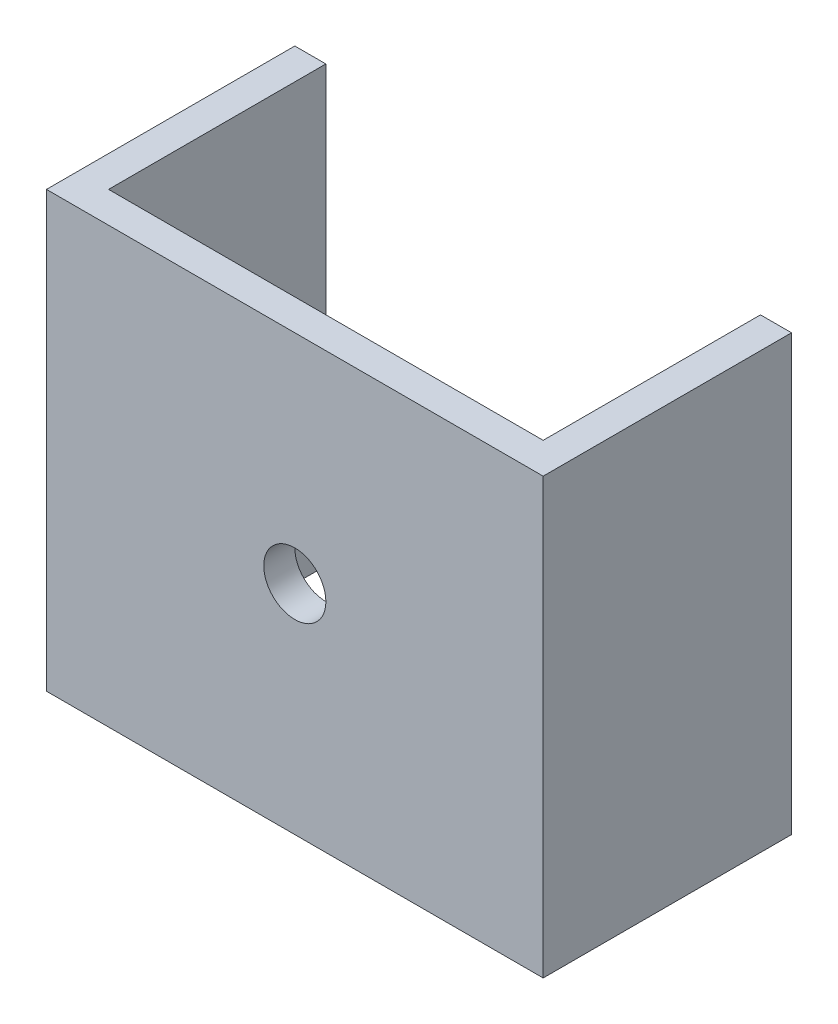
ISO-10303-21;
HEADER;
FILE_DESCRIPTION(('STEP AP214'),'2;1');
FILE_NAME('part.step','',(''),(''),'','','');
FILE_SCHEMA(('AUTOMOTIVE_DESIGN { 1 0 10303 214 1 1 1 1 }'));
ENDSEC;
DATA;
#1=APPLICATION_CONTEXT('core data for automotive mechanical design processes');
#2=APPLICATION_PROTOCOL_DEFINITION('international standard','automotive_design',2000,#1);
#3=PRODUCT_CONTEXT('',#1,'mechanical');
#4=PRODUCT('Part','Part','',(#3));
#5=PRODUCT_RELATED_PRODUCT_CATEGORY('part','',(#4));
#6=PRODUCT_DEFINITION_FORMATION('','',#4);
#7=PRODUCT_DEFINITION_CONTEXT('part definition',#1,'design');
#8=PRODUCT_DEFINITION('design','',#6,#7);
#9=PRODUCT_DEFINITION_SHAPE('','',#8);
#10=(LENGTH_UNIT() NAMED_UNIT(*) SI_UNIT(.MILLI.,.METRE.));
#11=(NAMED_UNIT(*) PLANE_ANGLE_UNIT() SI_UNIT($,.RADIAN.));
#12=(NAMED_UNIT(*) SI_UNIT($,.STERADIAN.) SOLID_ANGLE_UNIT());
#13=UNCERTAINTY_MEASURE_WITH_UNIT(LENGTH_MEASURE(1.E-05),#10,'distance_accuracy_value','');
#14=(GEOMETRIC_REPRESENTATION_CONTEXT(3) GLOBAL_UNCERTAINTY_ASSIGNED_CONTEXT((#13)) GLOBAL_UNIT_ASSIGNED_CONTEXT((#10,
#11,#12)) REPRESENTATION_CONTEXT('',''));
#15=CARTESIAN_POINT('',(0.,0.,0.));
#16=DIRECTION('',(0.,0.,1.));
#17=DIRECTION('',(1.,0.,0.));
#18=AXIS2_PLACEMENT_3D('',#15,#16,#17);
#19=CARTESIAN_POINT('',(0.,44.45,0.));
#20=DIRECTION('',(1.,0.,0.));
#21=DIRECTION('',(0.,0.,-1.));
#22=AXIS2_PLACEMENT_3D('',#19,#20,#21);
#23=PLANE('',#22);
#24=DIRECTION('',(0.,0.,1.));
#25=VECTOR('',#24,1.);
#26=CARTESIAN_POINT('',(0.,0.,0.));
#27=LINE('',#26,#25);
#28=CARTESIAN_POINT('',(0.,0.,-25.4));
#29=VERTEX_POINT('',#28);
#30=CARTESIAN_POINT('',(0.,0.,0.));
#31=VERTEX_POINT('',#30);
#32=EDGE_CURVE('E130',#29,#31,#27,.T.);
#33=ORIENTED_EDGE('',*,*,#32,.T.);
#34=DIRECTION('',(0.,-1.,0.));
#35=VECTOR('',#34,1.);
#36=CARTESIAN_POINT('',(0.,44.45,0.));
#37=LINE('',#36,#35);
#38=CARTESIAN_POINT('',(0.,44.45,0.));
#39=VERTEX_POINT('',#38);
#40=EDGE_CURVE('E11',#39,#31,#37,.T.);
#41=ORIENTED_EDGE('',*,*,#40,.F.);
#42=DIRECTION('',(0.,0.,1.));
#43=VECTOR('',#42,1.);
#44=CARTESIAN_POINT('',(0.,44.45,0.));
#45=LINE('',#44,#43);
#46=CARTESIAN_POINT('',(0.,44.45,-25.4));
#47=VERTEX_POINT('',#46);
#48=EDGE_CURVE('E144',#47,#39,#45,.T.);
#49=ORIENTED_EDGE('',*,*,#48,.F.);
#50=DIRECTION('',(0.,-1.,0.));
#51=VECTOR('',#50,1.);
#52=CARTESIAN_POINT('',(0.,44.45,-25.4));
#53=LINE('',#52,#51);
#54=EDGE_CURVE('E126',#47,#29,#53,.T.);
#55=ORIENTED_EDGE('',*,*,#54,.T.);
#56=EDGE_LOOP('',(#33,#41,#49,#55));
#57=FACE_BOUND('',#56,.T.);
#58=ADVANCED_FACE('F33',(#57),#23,.F.);
#59=CARTESIAN_POINT('',(0.,44.45,0.));
#60=DIRECTION('',(0.,0.,-1.));
#61=DIRECTION('',(-1.,0.,0.));
#62=AXIS2_PLACEMENT_3D('',#59,#60,#61);
#63=PLANE('',#62);
#64=CARTESIAN_POINT('',(25.4000000000001,22.225,0.));
#65=DIRECTION('',(0.,0.,1.));
#66=DIRECTION('',(1.,0.,0.));
#67=AXIS2_PLACEMENT_3D('',#64,#65,#66);
#68=CIRCLE('',#67,3.175);
#69=CARTESIAN_POINT('',(28.5750000000001,22.225,0.));
#70=VERTEX_POINT('',#69);
#71=EDGE_CURVE('E178',#70,#70,#68,.T.);
#72=ORIENTED_EDGE('',*,*,#71,.F.);
#73=EDGE_LOOP('',(#72));
#74=FACE_BOUND('',#73,.T.);
#75=DIRECTION('',(1.,0.,0.));
#76=VECTOR('',#75,1.);
#77=CARTESIAN_POINT('',(0.,0.,0.));
#78=LINE('',#77,#76);
#79=CARTESIAN_POINT('',(50.8,0.,0.));
#80=VERTEX_POINT('',#79);
#81=EDGE_CURVE('E133',#31,#80,#78,.T.);
#82=ORIENTED_EDGE('',*,*,#81,.T.);
#83=DIRECTION('',(0.,-1.,0.));
#84=VECTOR('',#83,1.);
#85=CARTESIAN_POINT('',(50.8,44.45,0.));
#86=LINE('',#85,#84);
#87=CARTESIAN_POINT('',(50.8,44.45,0.));
#88=VERTEX_POINT('',#87);
#89=EDGE_CURVE('E42',#88,#80,#86,.T.);
#90=ORIENTED_EDGE('',*,*,#89,.F.);
#91=DIRECTION('',(1.,0.,0.));
#92=VECTOR('',#91,1.);
#93=CARTESIAN_POINT('',(0.,44.45,0.));
#94=LINE('',#93,#92);
#95=EDGE_CURVE('E93',#39,#88,#94,.T.);
#96=ORIENTED_EDGE('',*,*,#95,.F.);
#97=ORIENTED_EDGE('',*,*,#40,.T.);
#98=EDGE_LOOP('',(#82,#90,#96,#97));
#99=FACE_BOUND('',#98,.T.);
#100=ADVANCED_FACE('F195',(#74,#99),#63,.F.);
#101=CARTESIAN_POINT('',(50.8,44.45,0.));
#102=DIRECTION('',(-1.,0.,0.));
#103=DIRECTION('',(0.,0.,1.));
#104=AXIS2_PLACEMENT_3D('',#101,#102,#103);
#105=PLANE('',#104);
#106=DIRECTION('',(0.,0.,-1.));
#107=VECTOR('',#106,1.);
#108=CARTESIAN_POINT('',(50.8,0.,0.));
#109=LINE('',#108,#107);
#110=CARTESIAN_POINT('',(50.8,0.,-25.4));
#111=VERTEX_POINT('',#110);
#112=EDGE_CURVE('E135',#80,#111,#109,.T.);
#113=ORIENTED_EDGE('',*,*,#112,.T.);
#114=DIRECTION('',(0.,-1.,0.));
#115=VECTOR('',#114,1.);
#116=CARTESIAN_POINT('',(50.8,44.45,-25.4));
#117=LINE('',#116,#115);
#118=CARTESIAN_POINT('',(50.8,44.45,-25.4));
#119=VERTEX_POINT('',#118);
#120=EDGE_CURVE('E151',#119,#111,#117,.T.);
#121=ORIENTED_EDGE('',*,*,#120,.F.);
#122=DIRECTION('',(0.,0.,-1.));
#123=VECTOR('',#122,1.);
#124=CARTESIAN_POINT('',(50.8,44.45,0.));
#125=LINE('',#124,#123);
#126=EDGE_CURVE('E160',#88,#119,#125,.T.);
#127=ORIENTED_EDGE('',*,*,#126,.F.);
#128=ORIENTED_EDGE('',*,*,#89,.T.);
#129=EDGE_LOOP('',(#113,#121,#127,#128));
#130=FACE_BOUND('',#129,.T.);
#131=ADVANCED_FACE('F158',(#130),#105,.F.);
#132=CARTESIAN_POINT('',(47.625,44.45,-25.4));
#133=DIRECTION('',(0.,0.,1.));
#134=DIRECTION('',(1.,0.,0.));
#135=AXIS2_PLACEMENT_3D('',#132,#133,#134);
#136=PLANE('',#135);
#137=DIRECTION('',(-1.,0.,0.));
#138=VECTOR('',#137,1.);
#139=CARTESIAN_POINT('',(47.625,0.,-25.4));
#140=LINE('',#139,#138);
#141=CARTESIAN_POINT('',(47.625,0.,-25.4));
#142=VERTEX_POINT('',#141);
#143=EDGE_CURVE('E137',#111,#142,#140,.T.);
#144=ORIENTED_EDGE('',*,*,#143,.T.);
#145=DIRECTION('',(0.,-1.,0.));
#146=VECTOR('',#145,1.);
#147=CARTESIAN_POINT('',(47.625,44.45,-25.4));
#148=LINE('',#147,#146);
#149=CARTESIAN_POINT('',(47.625,44.45,-25.4));
#150=VERTEX_POINT('',#149);
#151=EDGE_CURVE('E148',#150,#142,#148,.T.);
#152=ORIENTED_EDGE('',*,*,#151,.F.);
#153=DIRECTION('',(-1.,0.,0.));
#154=VECTOR('',#153,1.);
#155=CARTESIAN_POINT('',(47.625,44.45,-25.4));
#156=LINE('',#155,#154);
#157=EDGE_CURVE('E172',#119,#150,#156,.T.);
#158=ORIENTED_EDGE('',*,*,#157,.F.);
#159=ORIENTED_EDGE('',*,*,#120,.T.);
#160=EDGE_LOOP('',(#144,#152,#158,#159));
#161=FACE_BOUND('',#160,.T.);
#162=ADVANCED_FACE('F168',(#161),#136,.F.);
#163=CARTESIAN_POINT('',(47.625,44.45,-25.4));
#164=DIRECTION('',(1.,0.,0.));
#165=DIRECTION('',(0.,0.,-1.));
#166=AXIS2_PLACEMENT_3D('',#163,#164,#165);
#167=PLANE('',#166);
#168=DIRECTION('',(0.,0.,1.));
#169=VECTOR('',#168,1.);
#170=CARTESIAN_POINT('',(47.625,0.,-25.4));
#171=LINE('',#170,#169);
#172=CARTESIAN_POINT('',(47.625,0.,-3.175));
#173=VERTEX_POINT('',#172);
#174=EDGE_CURVE('E139',#142,#173,#171,.T.);
#175=ORIENTED_EDGE('',*,*,#174,.T.);
#176=DIRECTION('',(0.,-1.,0.));
#177=VECTOR('',#176,1.);
#178=CARTESIAN_POINT('',(47.625,44.45,-3.175));
#179=LINE('',#178,#177);
#180=CARTESIAN_POINT('',(47.625,44.45,-3.175));
#181=VERTEX_POINT('',#180);
#182=EDGE_CURVE('E121',#181,#173,#179,.T.);
#183=ORIENTED_EDGE('',*,*,#182,.F.);
#184=DIRECTION('',(0.,0.,1.));
#185=VECTOR('',#184,1.);
#186=CARTESIAN_POINT('',(47.625,44.45,-25.4));
#187=LINE('',#186,#185);
#188=EDGE_CURVE('E112',#150,#181,#187,.T.);
#189=ORIENTED_EDGE('',*,*,#188,.F.);
#190=ORIENTED_EDGE('',*,*,#151,.T.);
#191=EDGE_LOOP('',(#175,#183,#189,#190));
#192=FACE_BOUND('',#191,.T.);
#193=ADVANCED_FACE('F171',(#192),#167,.F.);
#194=CARTESIAN_POINT('',(3.17500000000001,44.45,-3.175));
#195=DIRECTION('',(0.,0.,1.));
#196=DIRECTION('',(1.,0.,0.));
#197=AXIS2_PLACEMENT_3D('',#194,#195,#196);
#198=PLANE('',#197);
#199=CARTESIAN_POINT('',(25.4000000000001,22.225,-3.175));
#200=DIRECTION('',(0.,0.,1.));
#201=DIRECTION('',(1.,0.,0.));
#202=AXIS2_PLACEMENT_3D('',#199,#200,#201);
#203=CIRCLE('',#202,3.175);
#204=CARTESIAN_POINT('',(28.5750000000001,22.225,-3.175));
#205=VERTEX_POINT('',#204);
#206=EDGE_CURVE('E36',#205,#205,#203,.T.);
#207=ORIENTED_EDGE('',*,*,#206,.T.);
#208=EDGE_LOOP('',(#207));
#209=FACE_BOUND('',#208,.T.);
#210=DIRECTION('',(-1.,0.,0.));
#211=VECTOR('',#210,1.);
#212=CARTESIAN_POINT('',(3.17500000000001,0.,-3.175));
#213=LINE('',#212,#211);
#214=CARTESIAN_POINT('',(3.17500000000001,0.,-3.175));
#215=VERTEX_POINT('',#214);
#216=EDGE_CURVE('E120',#173,#215,#213,.T.);
#217=ORIENTED_EDGE('',*,*,#216,.T.);
#218=DIRECTION('',(0.,-1.,0.));
#219=VECTOR('',#218,1.);
#220=CARTESIAN_POINT('',(3.17500000000001,44.45,-3.175));
#221=LINE('',#220,#219);
#222=CARTESIAN_POINT('',(3.17500000000001,44.45,-3.175));
#223=VERTEX_POINT('',#222);
#224=EDGE_CURVE('E117',#223,#215,#221,.T.);
#225=ORIENTED_EDGE('',*,*,#224,.F.);
#226=DIRECTION('',(-1.,0.,0.));
#227=VECTOR('',#226,1.);
#228=CARTESIAN_POINT('',(3.17500000000001,44.45,-3.175));
#229=LINE('',#228,#227);
#230=EDGE_CURVE('E106',#181,#223,#229,.T.);
#231=ORIENTED_EDGE('',*,*,#230,.F.);
#232=ORIENTED_EDGE('',*,*,#182,.T.);
#233=EDGE_LOOP('',(#217,#225,#231,#232));
#234=FACE_BOUND('',#233,.T.);
#235=ADVANCED_FACE('F118',(#209,#234),#198,.F.);
#236=CARTESIAN_POINT('',(3.175,44.45,-25.4));
#237=DIRECTION('',(-1.,0.,0.));
#238=DIRECTION('',(0.,0.,1.));
#239=AXIS2_PLACEMENT_3D('',#236,#237,#238);
#240=PLANE('',#239);
#241=DIRECTION('',(0.,0.,-1.));
#242=VECTOR('',#241,1.);
#243=CARTESIAN_POINT('',(3.175,0.,-25.4));
#244=LINE('',#243,#242);
#245=CARTESIAN_POINT('',(3.175,0.,-25.4));
#246=VERTEX_POINT('',#245);
#247=EDGE_CURVE('E79',#215,#246,#244,.T.);
#248=ORIENTED_EDGE('',*,*,#247,.T.);
#249=DIRECTION('',(0.,-1.,0.));
#250=VECTOR('',#249,1.);
#251=CARTESIAN_POINT('',(3.175,44.45,-25.4));
#252=LINE('',#251,#250);
#253=CARTESIAN_POINT('',(3.175,44.45,-25.4));
#254=VERTEX_POINT('',#253);
#255=EDGE_CURVE('E122',#254,#246,#252,.T.);
#256=ORIENTED_EDGE('',*,*,#255,.F.);
#257=DIRECTION('',(0.,0.,-1.));
#258=VECTOR('',#257,1.);
#259=CARTESIAN_POINT('',(3.175,44.45,-25.4));
#260=LINE('',#259,#258);
#261=EDGE_CURVE('E110',#223,#254,#260,.T.);
#262=ORIENTED_EDGE('',*,*,#261,.F.);
#263=ORIENTED_EDGE('',*,*,#224,.T.);
#264=EDGE_LOOP('',(#248,#256,#262,#263));
#265=FACE_BOUND('',#264,.T.);
#266=ADVANCED_FACE('F124',(#265),#240,.F.);
#267=CARTESIAN_POINT('',(0.,44.45,-25.4));
#268=DIRECTION('',(0.,0.,1.));
#269=DIRECTION('',(1.,0.,0.));
#270=AXIS2_PLACEMENT_3D('',#267,#268,#269);
#271=PLANE('',#270);
#272=DIRECTION('',(-1.,0.,0.));
#273=VECTOR('',#272,1.);
#274=CARTESIAN_POINT('',(0.,0.,-25.4));
#275=LINE('',#274,#273);
#276=EDGE_CURVE('E85',#246,#29,#275,.T.);
#277=ORIENTED_EDGE('',*,*,#276,.T.);
#278=ORIENTED_EDGE('',*,*,#54,.F.);
#279=DIRECTION('',(-1.,0.,0.));
#280=VECTOR('',#279,1.);
#281=CARTESIAN_POINT('',(0.,44.45,-25.4));
#282=LINE('',#281,#280);
#283=EDGE_CURVE('E50',#254,#47,#282,.T.);
#284=ORIENTED_EDGE('',*,*,#283,.F.);
#285=ORIENTED_EDGE('',*,*,#255,.T.);
#286=EDGE_LOOP('',(#277,#278,#284,#285));
#287=FACE_BOUND('',#286,.T.);
#288=ADVANCED_FACE('F203',(#287),#271,.F.);
#289=CARTESIAN_POINT('',(0.,44.45,0.));
#290=DIRECTION('',(0.,-1.,0.));
#291=DIRECTION('',(0.,0.,-1.));
#292=AXIS2_PLACEMENT_3D('',#289,#290,#291);
#293=PLANE('',#292);
#294=ORIENTED_EDGE('',*,*,#48,.T.);
#295=ORIENTED_EDGE('',*,*,#95,.T.);
#296=ORIENTED_EDGE('',*,*,#126,.T.);
#297=ORIENTED_EDGE('',*,*,#157,.T.);
#298=ORIENTED_EDGE('',*,*,#188,.T.);
#299=ORIENTED_EDGE('',*,*,#230,.T.);
#300=ORIENTED_EDGE('',*,*,#261,.T.);
#301=ORIENTED_EDGE('',*,*,#283,.T.);
#302=EDGE_LOOP('',(#294,#295,#296,#297,#298,#299,#300,#301));
#303=FACE_BOUND('',#302,.T.);
#304=ADVANCED_FACE('F108',(#303),#293,.F.);
#305=CARTESIAN_POINT('',(0.,0.,0.));
#306=DIRECTION('',(0.,-1.,0.));
#307=DIRECTION('',(0.,0.,-1.));
#308=AXIS2_PLACEMENT_3D('',#305,#306,#307);
#309=PLANE('',#308);
#310=ORIENTED_EDGE('',*,*,#32,.F.);
#311=ORIENTED_EDGE('',*,*,#276,.F.);
#312=ORIENTED_EDGE('',*,*,#247,.F.);
#313=ORIENTED_EDGE('',*,*,#216,.F.);
#314=ORIENTED_EDGE('',*,*,#174,.F.);
#315=ORIENTED_EDGE('',*,*,#143,.F.);
#316=ORIENTED_EDGE('',*,*,#112,.F.);
#317=ORIENTED_EDGE('',*,*,#81,.F.);
#318=EDGE_LOOP('',(#310,#311,#312,#313,#314,#315,#316,#317));
#319=FACE_BOUND('',#318,.T.);
#320=ADVANCED_FACE('F164',(#319),#309,.T.);
#321=CARTESIAN_POINT('',(25.4000000000001,22.225,-25.4));
#322=DIRECTION('',(0.,0.,1.));
#323=DIRECTION('',(1.,0.,0.));
#324=AXIS2_PLACEMENT_3D('',#321,#322,#323);
#325=CYLINDRICAL_SURFACE('',#324,3.175);
#326=ORIENTED_EDGE('',*,*,#71,.T.);
#327=EDGE_LOOP('',(#326));
#328=FACE_BOUND('',#327,.T.);
#329=ORIENTED_EDGE('',*,*,#206,.F.);
#330=EDGE_LOOP('',(#329));
#331=FACE_BOUND('',#330,.T.);
#332=ADVANCED_FACE('F186',(#328,#331),#325,.F.);
#333=CLOSED_SHELL('',(#58,#100,#131,#162,#193,#235,#266,#288,#304,#320,#332));
#334=MANIFOLD_SOLID_BREP('B2',#333);
#335=ADVANCED_BREP_SHAPE_REPRESENTATION('',(#18,#334),#14);
#336=SHAPE_DEFINITION_REPRESENTATION(#9,#335);
ENDSEC;
END-ISO-10303-21;
